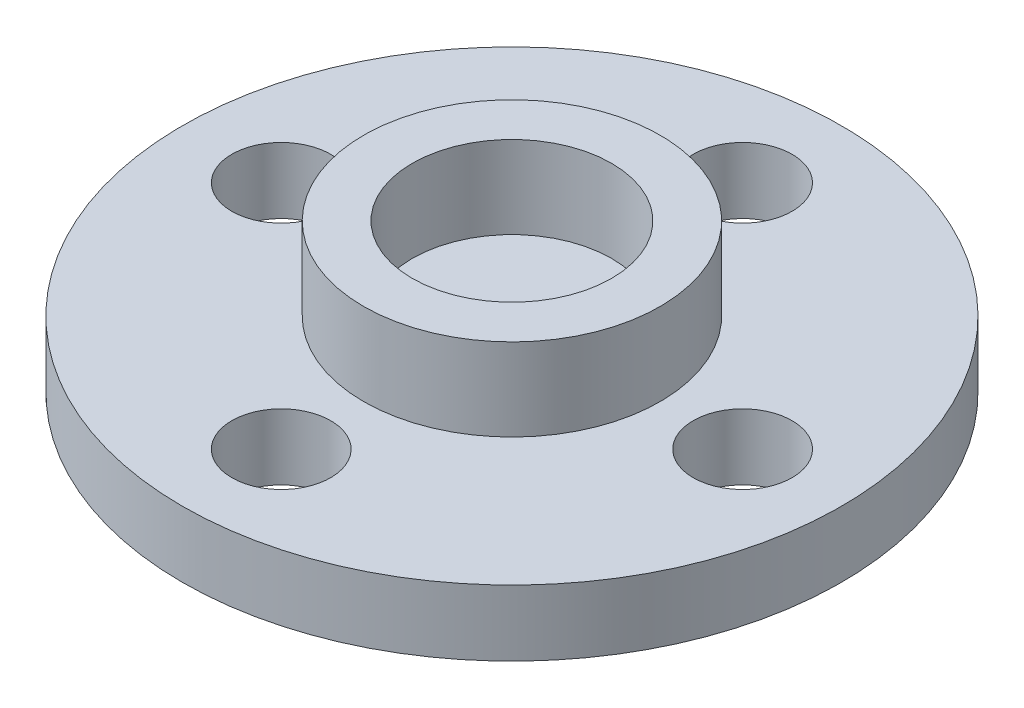
ISO-10303-21;
HEADER;
FILE_DESCRIPTION(('STEP AP214'),'2;1');
FILE_NAME('part.step','',(''),(''),'','','');
FILE_SCHEMA(('AUTOMOTIVE_DESIGN { 1 0 10303 214 1 1 1 1 }'));
ENDSEC;
DATA;
#1=APPLICATION_CONTEXT('core data for automotive mechanical design processes');
#2=APPLICATION_PROTOCOL_DEFINITION('international standard','automotive_design',2000,#1);
#3=PRODUCT_CONTEXT('',#1,'mechanical');
#4=PRODUCT('Part','Part','',(#3));
#5=PRODUCT_RELATED_PRODUCT_CATEGORY('part','',(#4));
#6=PRODUCT_DEFINITION_FORMATION('','',#4);
#7=PRODUCT_DEFINITION_CONTEXT('part definition',#1,'design');
#8=PRODUCT_DEFINITION('design','',#6,#7);
#9=PRODUCT_DEFINITION_SHAPE('','',#8);
#10=(LENGTH_UNIT() NAMED_UNIT(*) SI_UNIT(.MILLI.,.METRE.));
#11=(NAMED_UNIT(*) PLANE_ANGLE_UNIT() SI_UNIT($,.RADIAN.));
#12=(NAMED_UNIT(*) SI_UNIT($,.STERADIAN.) SOLID_ANGLE_UNIT());
#13=UNCERTAINTY_MEASURE_WITH_UNIT(LENGTH_MEASURE(1.E-05),#10,'distance_accuracy_value','');
#14=(GEOMETRIC_REPRESENTATION_CONTEXT(3) GLOBAL_UNCERTAINTY_ASSIGNED_CONTEXT((#13)) GLOBAL_UNIT_ASSIGNED_CONTEXT((#10,
#11,#12)) REPRESENTATION_CONTEXT('',''));
#15=CARTESIAN_POINT('',(0.,0.,0.));
#16=DIRECTION('',(0.,0.,1.));
#17=DIRECTION('',(1.,0.,0.));
#18=AXIS2_PLACEMENT_3D('',#15,#16,#17);
#19=CARTESIAN_POINT('',(0.,2.,0.));
#20=DIRECTION('',(0.,-1.,0.));
#21=DIRECTION('',(0.,0.,-1.));
#22=AXIS2_PLACEMENT_3D('',#19,#20,#21);
#23=CYLINDRICAL_SURFACE('',#22,10.);
#24=CARTESIAN_POINT('',(0.,2.,0.));
#25=DIRECTION('',(0.,1.,0.));
#26=DIRECTION('',(0.,0.,1.));
#27=AXIS2_PLACEMENT_3D('',#24,#25,#26);
#28=CIRCLE('',#27,10.);
#29=CARTESIAN_POINT('',(0.,2.,10.));
#30=VERTEX_POINT('',#29);
#31=EDGE_CURVE('E41',#30,#30,#28,.T.);
#32=ORIENTED_EDGE('',*,*,#31,.F.);
#33=EDGE_LOOP('',(#32));
#34=FACE_BOUND('',#33,.T.);
#35=CARTESIAN_POINT('',(0.,0.,0.));
#36=DIRECTION('',(0.,1.,0.));
#37=DIRECTION('',(0.,0.,1.));
#38=AXIS2_PLACEMENT_3D('',#35,#36,#37);
#39=CIRCLE('',#38,10.);
#40=CARTESIAN_POINT('',(0.,0.,10.));
#41=VERTEX_POINT('',#40);
#42=EDGE_CURVE('E46',#41,#41,#39,.T.);
#43=ORIENTED_EDGE('',*,*,#42,.T.);
#44=EDGE_LOOP('',(#43));
#45=FACE_BOUND('',#44,.T.);
#46=ADVANCED_FACE('F34',(#34,#45),#23,.T.);
#47=CARTESIAN_POINT('',(0.,2.,0.));
#48=DIRECTION('',(0.,1.,0.));
#49=DIRECTION('',(0.,0.,1.));
#50=AXIS2_PLACEMENT_3D('',#47,#48,#49);
#51=PLANE('',#50);
#52=CARTESIAN_POINT('',(0.,2.,-7.));
#53=DIRECTION('',(0.,1.,0.));
#54=DIRECTION('',(0.,0.,1.));
#55=AXIS2_PLACEMENT_3D('',#52,#53,#54);
#56=CIRCLE('',#55,1.49999999999999);
#57=CARTESIAN_POINT('',(0.,2.,-5.50000000000001));
#58=VERTEX_POINT('',#57);
#59=EDGE_CURVE('E77',#58,#58,#56,.T.);
#60=ORIENTED_EDGE('',*,*,#59,.F.);
#61=EDGE_LOOP('',(#60));
#62=FACE_BOUND('',#61,.T.);
#63=CARTESIAN_POINT('',(-7.,2.,0.));
#64=DIRECTION('',(0.,1.,0.));
#65=DIRECTION('',(0.,0.,1.));
#66=AXIS2_PLACEMENT_3D('',#63,#64,#65);
#67=CIRCLE('',#66,1.49999999999999);
#68=CARTESIAN_POINT('',(-7.,2.,1.49999999999999));
#69=VERTEX_POINT('',#68);
#70=EDGE_CURVE('E71',#69,#69,#67,.T.);
#71=ORIENTED_EDGE('',*,*,#70,.F.);
#72=EDGE_LOOP('',(#71));
#73=FACE_BOUND('',#72,.T.);
#74=CARTESIAN_POINT('',(7.,2.,0.));
#75=DIRECTION('',(0.,1.,0.));
#76=DIRECTION('',(0.,0.,1.));
#77=AXIS2_PLACEMENT_3D('',#74,#75,#76);
#78=CIRCLE('',#77,1.49999999999999);
#79=CARTESIAN_POINT('',(7.,2.,1.49999999999999));
#80=VERTEX_POINT('',#79);
#81=EDGE_CURVE('E65',#80,#80,#78,.T.);
#82=ORIENTED_EDGE('',*,*,#81,.F.);
#83=EDGE_LOOP('',(#82));
#84=FACE_BOUND('',#83,.T.);
#85=CARTESIAN_POINT('',(0.,2.,7.));
#86=DIRECTION('',(0.,1.,0.));
#87=DIRECTION('',(0.,0.,1.));
#88=AXIS2_PLACEMENT_3D('',#85,#86,#87);
#89=CIRCLE('',#88,1.49999999999999);
#90=CARTESIAN_POINT('',(0.,2.,8.49999999999999));
#91=VERTEX_POINT('',#90);
#92=EDGE_CURVE('E59',#91,#91,#89,.T.);
#93=ORIENTED_EDGE('',*,*,#92,.F.);
#94=EDGE_LOOP('',(#93));
#95=FACE_BOUND('',#94,.T.);
#96=CARTESIAN_POINT('',(0.,2.,0.));
#97=DIRECTION('',(0.,1.,0.));
#98=DIRECTION('',(0.,0.,1.));
#99=AXIS2_PLACEMENT_3D('',#96,#97,#98);
#100=CIRCLE('',#99,4.5);
#101=CARTESIAN_POINT('',(0.,2.,4.5));
#102=VERTEX_POINT('',#101);
#103=EDGE_CURVE('E10',#102,#102,#100,.T.);
#104=ORIENTED_EDGE('',*,*,#103,.F.);
#105=EDGE_LOOP('',(#104));
#106=FACE_BOUND('',#105,.T.);
#107=ORIENTED_EDGE('',*,*,#31,.T.);
#108=EDGE_LOOP('',(#107));
#109=FACE_BOUND('',#108,.T.);
#110=ADVANCED_FACE('F105',(#62,#73,#84,#95,#106,#109),#51,.T.);
#111=CARTESIAN_POINT('',(0.,0.,0.));
#112=DIRECTION('',(0.,1.,0.));
#113=DIRECTION('',(0.,0.,1.));
#114=AXIS2_PLACEMENT_3D('',#111,#112,#113);
#115=PLANE('',#114);
#116=CARTESIAN_POINT('',(0.,0.,-7.));
#117=DIRECTION('',(0.,1.,0.));
#118=DIRECTION('',(0.,0.,1.));
#119=AXIS2_PLACEMENT_3D('',#116,#117,#118);
#120=CIRCLE('',#119,1.49999999999999);
#121=CARTESIAN_POINT('',(0.,0.,-5.50000000000001));
#122=VERTEX_POINT('',#121);
#123=EDGE_CURVE('E74',#122,#122,#120,.T.);
#124=ORIENTED_EDGE('',*,*,#123,.T.);
#125=EDGE_LOOP('',(#124));
#126=FACE_BOUND('',#125,.T.);
#127=CARTESIAN_POINT('',(-7.,0.,0.));
#128=DIRECTION('',(0.,1.,0.));
#129=DIRECTION('',(0.,0.,1.));
#130=AXIS2_PLACEMENT_3D('',#127,#128,#129);
#131=CIRCLE('',#130,1.49999999999999);
#132=CARTESIAN_POINT('',(-7.,0.,1.49999999999999));
#133=VERTEX_POINT('',#132);
#134=EDGE_CURVE('E68',#133,#133,#131,.T.);
#135=ORIENTED_EDGE('',*,*,#134,.T.);
#136=EDGE_LOOP('',(#135));
#137=FACE_BOUND('',#136,.T.);
#138=CARTESIAN_POINT('',(7.,0.,0.));
#139=DIRECTION('',(0.,1.,0.));
#140=DIRECTION('',(0.,0.,1.));
#141=AXIS2_PLACEMENT_3D('',#138,#139,#140);
#142=CIRCLE('',#141,1.49999999999999);
#143=CARTESIAN_POINT('',(7.,0.,1.49999999999999));
#144=VERTEX_POINT('',#143);
#145=EDGE_CURVE('E37',#144,#144,#142,.T.);
#146=ORIENTED_EDGE('',*,*,#145,.T.);
#147=EDGE_LOOP('',(#146));
#148=FACE_BOUND('',#147,.T.);
#149=CARTESIAN_POINT('',(0.,0.,7.));
#150=DIRECTION('',(0.,1.,0.));
#151=DIRECTION('',(0.,0.,1.));
#152=AXIS2_PLACEMENT_3D('',#149,#150,#151);
#153=CIRCLE('',#152,1.49999999999999);
#154=CARTESIAN_POINT('',(0.,0.,8.49999999999999));
#155=VERTEX_POINT('',#154);
#156=EDGE_CURVE('E55',#155,#155,#153,.T.);
#157=ORIENTED_EDGE('',*,*,#156,.T.);
#158=EDGE_LOOP('',(#157));
#159=FACE_BOUND('',#158,.T.);
#160=ORIENTED_EDGE('',*,*,#42,.F.);
#161=EDGE_LOOP('',(#160));
#162=FACE_BOUND('',#161,.T.);
#163=ADVANCED_FACE('F101',(#126,#137,#148,#159,#162),#115,.F.);
#164=CARTESIAN_POINT('',(0.,4.5,0.));
#165=DIRECTION('',(0.,-1.,0.));
#166=DIRECTION('',(0.,0.,-1.));
#167=AXIS2_PLACEMENT_3D('',#164,#165,#166);
#168=CYLINDRICAL_SURFACE('',#167,4.5);
#169=CARTESIAN_POINT('',(0.,4.5,0.));
#170=DIRECTION('',(0.,1.,0.));
#171=DIRECTION('',(0.,0.,1.));
#172=AXIS2_PLACEMENT_3D('',#169,#170,#171);
#173=CIRCLE('',#172,4.5);
#174=CARTESIAN_POINT('',(0.,4.5,4.5));
#175=VERTEX_POINT('',#174);
#176=EDGE_CURVE('E49',#175,#175,#173,.T.);
#177=ORIENTED_EDGE('',*,*,#176,.F.);
#178=EDGE_LOOP('',(#177));
#179=FACE_BOUND('',#178,.T.);
#180=ORIENTED_EDGE('',*,*,#103,.T.);
#181=EDGE_LOOP('',(#180));
#182=FACE_BOUND('',#181,.T.);
#183=ADVANCED_FACE('F92',(#179,#182),#168,.T.);
#184=CARTESIAN_POINT('',(0.,4.5,0.));
#185=DIRECTION('',(0.,1.,0.));
#186=DIRECTION('',(0.,0.,1.));
#187=AXIS2_PLACEMENT_3D('',#184,#185,#186);
#188=PLANE('',#187);
#189=CARTESIAN_POINT('',(0.,4.5,0.));
#190=DIRECTION('',(0.,1.,0.));
#191=DIRECTION('',(0.,0.,1.));
#192=AXIS2_PLACEMENT_3D('',#189,#190,#191);
#193=CIRCLE('',#192,3.025);
#194=CARTESIAN_POINT('',(0.,4.5,3.025));
#195=VERTEX_POINT('',#194);
#196=EDGE_CURVE('E83',#195,#195,#193,.T.);
#197=ORIENTED_EDGE('',*,*,#196,.F.);
#198=EDGE_LOOP('',(#197));
#199=FACE_BOUND('',#198,.T.);
#200=ORIENTED_EDGE('',*,*,#176,.T.);
#201=EDGE_LOOP('',(#200));
#202=FACE_BOUND('',#201,.T.);
#203=ADVANCED_FACE('F89',(#199,#202),#188,.T.);
#204=CARTESIAN_POINT('',(0.,2.,7.));
#205=DIRECTION('',(0.,1.,0.));
#206=DIRECTION('',(0.,0.,1.));
#207=AXIS2_PLACEMENT_3D('',#204,#205,#206);
#208=CYLINDRICAL_SURFACE('',#207,1.49999999999999);
#209=ORIENTED_EDGE('',*,*,#92,.T.);
#210=EDGE_LOOP('',(#209));
#211=FACE_BOUND('',#210,.T.);
#212=ORIENTED_EDGE('',*,*,#156,.F.);
#213=EDGE_LOOP('',(#212));
#214=FACE_BOUND('',#213,.T.);
#215=ADVANCED_FACE('F91',(#211,#214),#208,.F.);
#216=CARTESIAN_POINT('',(7.,2.,0.));
#217=DIRECTION('',(0.,1.,0.));
#218=DIRECTION('',(0.,0.,1.));
#219=AXIS2_PLACEMENT_3D('',#216,#217,#218);
#220=CYLINDRICAL_SURFACE('',#219,1.49999999999999);
#221=ORIENTED_EDGE('',*,*,#81,.T.);
#222=EDGE_LOOP('',(#221));
#223=FACE_BOUND('',#222,.T.);
#224=ORIENTED_EDGE('',*,*,#145,.F.);
#225=EDGE_LOOP('',(#224));
#226=FACE_BOUND('',#225,.T.);
#227=ADVANCED_FACE('F98',(#223,#226),#220,.F.);
#228=CARTESIAN_POINT('',(-7.,2.,0.));
#229=DIRECTION('',(0.,1.,0.));
#230=DIRECTION('',(0.,0.,1.));
#231=AXIS2_PLACEMENT_3D('',#228,#229,#230);
#232=CYLINDRICAL_SURFACE('',#231,1.49999999999999);
#233=ORIENTED_EDGE('',*,*,#70,.T.);
#234=EDGE_LOOP('',(#233));
#235=FACE_BOUND('',#234,.T.);
#236=ORIENTED_EDGE('',*,*,#134,.F.);
#237=EDGE_LOOP('',(#236));
#238=FACE_BOUND('',#237,.T.);
#239=ADVANCED_FACE('F130',(#235,#238),#232,.F.);
#240=CARTESIAN_POINT('',(0.,2.,-7.));
#241=DIRECTION('',(0.,1.,0.));
#242=DIRECTION('',(0.,0.,1.));
#243=AXIS2_PLACEMENT_3D('',#240,#241,#242);
#244=CYLINDRICAL_SURFACE('',#243,1.49999999999999);
#245=ORIENTED_EDGE('',*,*,#59,.T.);
#246=EDGE_LOOP('',(#245));
#247=FACE_BOUND('',#246,.T.);
#248=ORIENTED_EDGE('',*,*,#123,.F.);
#249=EDGE_LOOP('',(#248));
#250=FACE_BOUND('',#249,.T.);
#251=ADVANCED_FACE('F139',(#247,#250),#244,.F.);
#252=CARTESIAN_POINT('',(0.,-6.55599205235722,0.));
#253=DIRECTION('',(0.,1.,0.));
#254=DIRECTION('',(0.,0.,1.));
#255=AXIS2_PLACEMENT_3D('',#252,#253,#254);
#256=CYLINDRICAL_SURFACE('',#255,3.025);
#257=CARTESIAN_POINT('',(0.,2.,0.));
#258=DIRECTION('',(0.,1.,0.));
#259=DIRECTION('',(0.,0.,1.));
#260=AXIS2_PLACEMENT_3D('',#257,#258,#259);
#261=CIRCLE('',#260,3.025);
#262=CARTESIAN_POINT('',(0.,2.,3.025));
#263=VERTEX_POINT('',#262);
#264=EDGE_CURVE('E80',#263,#263,#261,.F.);
#265=ORIENTED_EDGE('',*,*,#264,.T.);
#266=EDGE_LOOP('',(#265));
#267=FACE_BOUND('',#266,.T.);
#268=ORIENTED_EDGE('',*,*,#196,.T.);
#269=EDGE_LOOP('',(#268));
#270=FACE_BOUND('',#269,.T.);
#271=ADVANCED_FACE('F87',(#267,#270),#256,.F.);
#272=CARTESIAN_POINT('',(0.,2.,0.));
#273=DIRECTION('',(0.,1.,0.));
#274=DIRECTION('',(0.,0.,1.));
#275=AXIS2_PLACEMENT_3D('',#272,#273,#274);
#276=PLANE('',#275);
#277=ORIENTED_EDGE('',*,*,#264,.F.);
#278=EDGE_LOOP('',(#277));
#279=FACE_BOUND('',#278,.T.);
#280=ADVANCED_FACE('F148',(#279),#276,.T.);
#281=CLOSED_SHELL('',(#46,#110,#163,#183,#203,#215,#227,#239,#251,#271,#280));
#282=MANIFOLD_SOLID_BREP('B2',#281);
#283=ADVANCED_BREP_SHAPE_REPRESENTATION('',(#18,#282),#14);
#284=SHAPE_DEFINITION_REPRESENTATION(#9,#283);
ENDSEC;
END-ISO-10303-21;
